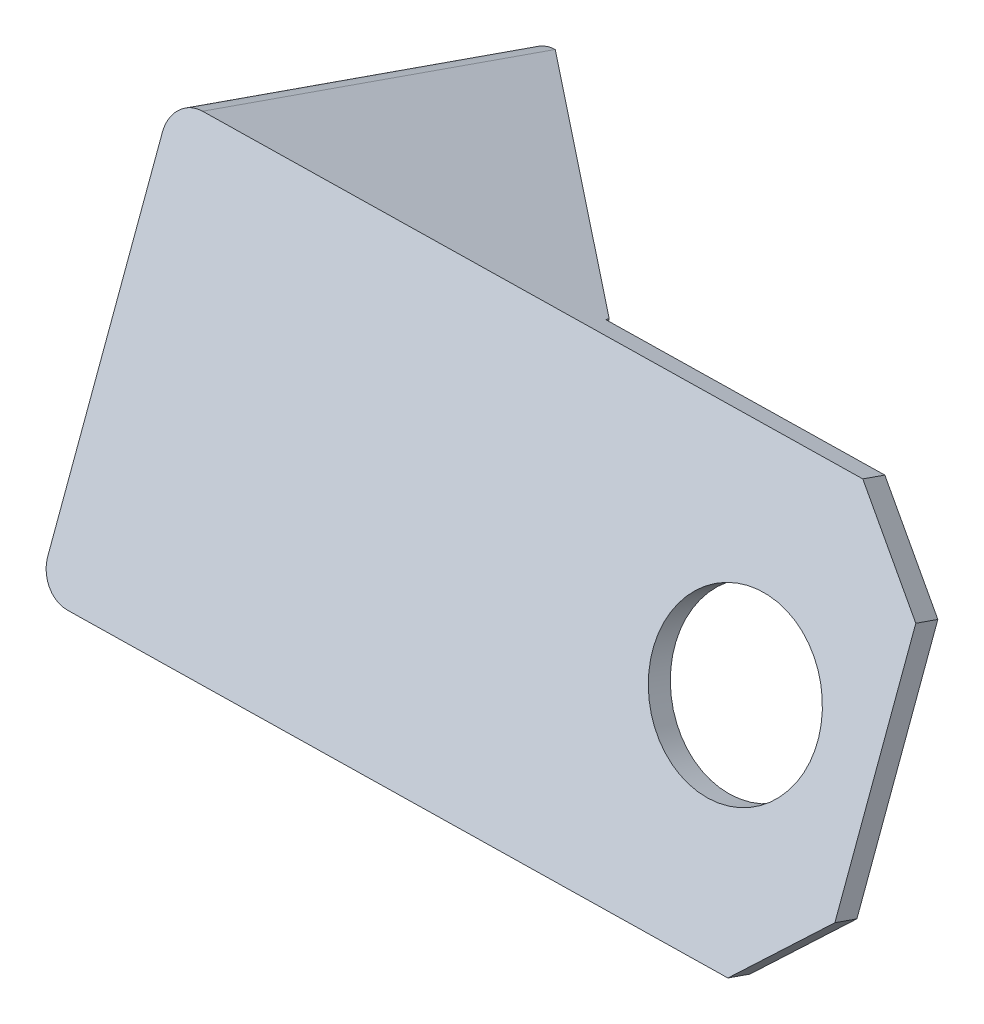
ISO-10303-21;
HEADER;
FILE_DESCRIPTION(('STEP AP214'),'2;1');
FILE_NAME('part.step','',(''),(''),'','','');
FILE_SCHEMA(('AUTOMOTIVE_DESIGN { 1 0 10303 214 1 1 1 1 }'));
ENDSEC;
DATA;
#1=APPLICATION_CONTEXT('core data for automotive mechanical design processes');
#2=APPLICATION_PROTOCOL_DEFINITION('international standard','automotive_design',2000,#1);
#3=PRODUCT_CONTEXT('',#1,'mechanical');
#4=PRODUCT('Part','Part','',(#3));
#5=PRODUCT_RELATED_PRODUCT_CATEGORY('part','',(#4));
#6=PRODUCT_DEFINITION_FORMATION('','',#4);
#7=PRODUCT_DEFINITION_CONTEXT('part definition',#1,'design');
#8=PRODUCT_DEFINITION('design','',#6,#7);
#9=PRODUCT_DEFINITION_SHAPE('','',#8);
#10=(LENGTH_UNIT() NAMED_UNIT(*) SI_UNIT(.MILLI.,.METRE.));
#11=(NAMED_UNIT(*) PLANE_ANGLE_UNIT() SI_UNIT($,.RADIAN.));
#12=(NAMED_UNIT(*) SI_UNIT($,.STERADIAN.) SOLID_ANGLE_UNIT());
#13=UNCERTAINTY_MEASURE_WITH_UNIT(LENGTH_MEASURE(1.E-05),#10,'distance_accuracy_value','');
#14=(GEOMETRIC_REPRESENTATION_CONTEXT(3) GLOBAL_UNCERTAINTY_ASSIGNED_CONTEXT((#13)) GLOBAL_UNIT_ASSIGNED_CONTEXT((#10,
#11,#12)) REPRESENTATION_CONTEXT('',''));
#15=CARTESIAN_POINT('',(0.,0.,0.));
#16=DIRECTION('',(0.,0.,1.));
#17=DIRECTION('',(1.,0.,0.));
#18=AXIS2_PLACEMENT_3D('',#15,#16,#17);
#19=CARTESIAN_POINT('',(215.494974936019,-7.09264298894702,-15.576413619024));
#20=DIRECTION('',(0.,-0.937926471174644,0.346834160183048));
#21=DIRECTION('',(0.,-0.346834160183048,-0.937926471174644));
#22=AXIS2_PLACEMENT_3D('',#19,#20,#21);
#23=PLANE('',#22);
#24=DIRECTION('',(-0.737684868865265,-0.234163416687779,-0.633236550218276));
#25=VECTOR('',#24,1.);
#26=CARTESIAN_POINT('',(215.494974936019,-7.09264298894702,-15.576413619024));
#27=LINE('',#26,#25);
#28=CARTESIAN_POINT('',(254.710935517627,5.35568516045379,18.0869847239463));
#29=VERTEX_POINT('',#28);
#30=CARTESIAN_POINT('',(215.494974936019,-7.09264298894719,-15.5764136190244));
#31=VERTEX_POINT('',#30);
#32=EDGE_CURVE('E215',#29,#31,#27,.T.);
#33=ORIENTED_EDGE('',*,*,#32,.F.);
#34=DIRECTION('',(0.0307715355767674,0.346669914844992,0.937482310627573));
#35=VECTOR('',#34,1.);
#36=CARTESIAN_POINT('',(253.569895079193,-7.49919465662855,-16.6758311931679));
#37=LINE('',#36,#35);
#38=CARTESIAN_POINT('',(254.723827663322,5.50092715005865,18.4797554553661));
#39=VERTEX_POINT('',#38);
#40=EDGE_CURVE('E190',#29,#39,#37,.T.);
#41=ORIENTED_EDGE('',*,*,#40,.T.);
#42=DIRECTION('',(-0.999526444171562,0.0106726196993108,0.0288614377761425));
#43=VECTOR('',#42,1.);
#44=CARTESIAN_POINT('',(216.648907520148,5.90747881774017,19.57917302951));
#45=LINE('',#44,#43);
#46=CARTESIAN_POINT('',(216.648907520148,5.90747881774016,19.57917302951));
#47=VERTEX_POINT('',#46);
#48=EDGE_CURVE('E180',#39,#47,#45,.T.);
#49=ORIENTED_EDGE('',*,*,#48,.T.);
#50=DIRECTION('',(0.0307715355767674,0.346669914844992,0.937482310627573));
#51=VECTOR('',#50,1.);
#52=CARTESIAN_POINT('',(215.494974936019,-7.09264298894702,-15.576413619024));
#53=LINE('',#52,#51);
#54=EDGE_CURVE('E406',#31,#47,#53,.T.);
#55=ORIENTED_EDGE('',*,*,#54,.F.);
#56=EDGE_LOOP('',(#33,#41,#49,#55));
#57=FACE_BOUND('',#56,.T.);
#58=ADVANCED_FACE('F41',(#57),#23,.T.);
#59=CARTESIAN_POINT('',(215.494974936019,-39.9200694800596,-3.43721801261732));
#60=DIRECTION('',(0.,-0.937926471174644,0.346834160183048));
#61=DIRECTION('',(0.,-0.346834160183048,-0.937926471174644));
#62=AXIS2_PLACEMENT_3D('',#59,#60,#61);
#63=PLANE('',#62);
#64=DIRECTION('',(0.0307715355767674,0.346669914844992,0.937482310627573));
#65=VECTOR('',#64,1.);
#66=CARTESIAN_POINT('',(253.569895079193,-40.3266211477411,-4.53663558676126));
#67=LINE('',#66,#65);
#68=CARTESIAN_POINT('',(254.710935517627,-27.4717413306588,30.2261803303528));
#69=VERTEX_POINT('',#68);
#70=CARTESIAN_POINT('',(254.723827663322,-27.3264993410539,30.6189510617728));
#71=VERTEX_POINT('',#70);
#72=EDGE_CURVE('E195',#69,#71,#67,.T.);
#73=ORIENTED_EDGE('',*,*,#72,.F.);
#74=DIRECTION('',(-0.737684868865265,-0.234163416687779,-0.633236550218276));
#75=VECTOR('',#74,1.);
#76=CARTESIAN_POINT('',(215.494974936019,-39.9200694800596,-3.43721801261732));
#77=LINE('',#76,#75);
#78=CARTESIAN_POINT('',(215.494974936018,-39.9200694800597,-3.43721801261775));
#79=VERTEX_POINT('',#78);
#80=EDGE_CURVE('E211',#69,#79,#77,.T.);
#81=ORIENTED_EDGE('',*,*,#80,.T.);
#82=DIRECTION('',(0.0307715355767674,0.346669914844992,0.937482310627573));
#83=VECTOR('',#82,1.);
#84=CARTESIAN_POINT('',(215.494974936019,-39.9200694800596,-3.43721801261732));
#85=LINE('',#84,#83);
#86=CARTESIAN_POINT('',(216.648907520147,-26.9199476733724,31.7183686359167));
#87=VERTEX_POINT('',#86);
#88=EDGE_CURVE('E304',#79,#87,#85,.T.);
#89=ORIENTED_EDGE('',*,*,#88,.T.);
#90=DIRECTION('',(-0.999526444171562,0.010672619699311,0.0288614377761424));
#91=VECTOR('',#90,1.);
#92=CARTESIAN_POINT('',(216.648907520148,-26.9199476733724,31.7183686359167));
#93=LINE('',#92,#91);
#94=EDGE_CURVE('E45',#71,#87,#93,.T.);
#95=ORIENTED_EDGE('',*,*,#94,.F.);
#96=EDGE_LOOP('',(#73,#81,#89,#95));
#97=FACE_BOUND('',#96,.T.);
#98=ADVANCED_FACE('F382',(#97),#63,.F.);
#99=CARTESIAN_POINT('',(215.494974936019,-42.2648856579962,-2.5701326121597));
#100=DIRECTION('',(0.,-0.937926471174644,0.346834160183048));
#101=DIRECTION('',(0.,-0.346834160183048,-0.937926471174644));
#102=AXIS2_PLACEMENT_3D('',#99,#100,#101);
#103=PLANE('',#102);
#104=DIRECTION('',(-0.737684868865265,-0.234163416687779,-0.633236550218276));
#105=VECTOR('',#104,1.);
#106=CARTESIAN_POINT('',(215.494974936019,-42.2648856579962,-2.5701326121597));
#107=LINE('',#106,#105);
#108=CARTESIAN_POINT('',(254.710935517627,-29.8165575085954,31.0932657308105));
#109=VERTEX_POINT('',#108);
#110=CARTESIAN_POINT('',(215.494974936019,-42.2648856579963,-2.57013261215999));
#111=VERTEX_POINT('',#110);
#112=EDGE_CURVE('E208',#109,#111,#107,.T.);
#113=ORIENTED_EDGE('',*,*,#112,.F.);
#114=DIRECTION('',(0.0307715355767674,0.346669914844992,0.937482310627573));
#115=VECTOR('',#114,1.);
#116=CARTESIAN_POINT('',(253.0313932066,-48.738160835465,-20.0754906222861));
#117=LINE('',#116,#115);
#118=CARTESIAN_POINT('',(254.723827663322,-29.6713155189905,31.4860364622304));
#119=VERTEX_POINT('',#118);
#120=EDGE_CURVE('E191',#109,#119,#117,.T.);
#121=ORIENTED_EDGE('',*,*,#120,.T.);
#122=DIRECTION('',(-0.999526444171562,0.0106726196993094,0.0288614377761415));
#123=VECTOR('',#122,1.);
#124=CARTESIAN_POINT('',(268.326224591561,-29.8165575085954,31.0932657308105));
#125=LINE('',#124,#123);
#126=CARTESIAN_POINT('',(282.644421009402,-29.9694425733565,30.6798262091352));
#127=VERTEX_POINT('',#126);
#128=EDGE_CURVE('E172',#127,#119,#125,.T.);
#129=ORIENTED_EDGE('',*,*,#128,.F.);
#130=DIRECTION('',(0.0307715355767674,0.346669914844992,0.937482310627573));
#131=VECTOR('',#130,1.);
#132=CARTESIAN_POINT('',(282.644421009402,-29.9694425733565,30.6798262091352));
#133=LINE('',#132,#131);
#134=CARTESIAN_POINT('',(282.721349848344,-29.1027677862441,33.0235319857041));
#135=VERTEX_POINT('',#134);
#136=EDGE_CURVE('E239',#127,#135,#133,.T.);
#137=ORIENTED_EDGE('',*,*,#136,.T.);
#138=DIRECTION('',(0.999526444171562,-0.0106726196993108,-0.0288614377761425));
#139=VECTOR('',#138,1.);
#140=CARTESIAN_POINT('',(216.725836359089,-28.3980890641965,34.9291598129432));
#141=LINE('',#140,#139);
#142=CARTESIAN_POINT('',(216.725836359089,-28.3980890641965,34.9291598129432));
#143=VERTEX_POINT('',#142);
#144=EDGE_CURVE('E52',#143,#135,#141,.T.);
#145=ORIENTED_EDGE('',*,*,#144,.F.);
#146=DIRECTION('',(0.0307715355767674,0.346669914844992,0.937482310627573));
#147=VECTOR('',#146,1.);
#148=CARTESIAN_POINT('',(215.494974936019,-42.2648856579962,-2.5701326121597));
#149=LINE('',#148,#147);
#150=EDGE_CURVE('E293',#111,#143,#149,.T.);
#151=ORIENTED_EDGE('',*,*,#150,.F.);
#152=EDGE_LOOP('',(#113,#121,#129,#137,#145,#151));
#153=FACE_BOUND('',#152,.T.);
#154=ADVANCED_FACE('F367',(#153),#103,.T.);
#155=CARTESIAN_POINT('',(215.494974936019,-4.74782681101041,-16.4434990194816));
#156=DIRECTION('',(0.,-0.937926471174644,0.346834160183048));
#157=DIRECTION('',(0.,-0.346834160183048,-0.937926471174644));
#158=AXIS2_PLACEMENT_3D('',#155,#156,#157);
#159=PLANE('',#158);
#160=DIRECTION('',(0.0307715355767674,0.346669914844992,0.937482310627573));
#161=VECTOR('',#160,1.);
#162=CARTESIAN_POINT('',(253.0313932066,-11.2211019884793,-33.9488570296081));
#163=LINE('',#162,#161);
#164=CARTESIAN_POINT('',(254.710935517627,7.70050133839038,17.2198993234886));
#165=VERTEX_POINT('',#164);
#166=CARTESIAN_POINT('',(254.723827663322,7.84574332799527,17.6126700549085));
#167=VERTEX_POINT('',#166);
#168=EDGE_CURVE('E165',#165,#167,#163,.T.);
#169=ORIENTED_EDGE('',*,*,#168,.F.);
#170=DIRECTION('',(0.737684868865265,0.234163416687779,0.633236550218276));
#171=VECTOR('',#170,1.);
#172=CARTESIAN_POINT('',(215.494974936019,-4.74782681101057,-16.443499019482));
#173=LINE('',#172,#171);
#174=CARTESIAN_POINT('',(215.494974936019,-4.74782681101057,-16.443499019482));
#175=VERTEX_POINT('',#174);
#176=EDGE_CURVE('E202',#175,#165,#173,.T.);
#177=ORIENTED_EDGE('',*,*,#176,.F.);
#178=DIRECTION('',(0.0307715355767674,0.346669914844992,0.937482310627573));
#179=VECTOR('',#178,1.);
#180=CARTESIAN_POINT('',(215.494974936019,-4.74782681101042,-16.4434990194816));
#181=LINE('',#180,#179);
#182=CARTESIAN_POINT('',(216.725836359089,9.11896978278926,21.0557934056213));
#183=VERTEX_POINT('',#182);
#184=EDGE_CURVE('E303',#175,#183,#181,.T.);
#185=ORIENTED_EDGE('',*,*,#184,.T.);
#186=DIRECTION('',(0.999526444171562,-0.0106726196993109,-0.0288614377761424));
#187=VECTOR('',#186,1.);
#188=CARTESIAN_POINT('',(216.725836359089,9.11896978278926,21.0557934056213));
#189=LINE('',#188,#187);
#190=CARTESIAN_POINT('',(282.721349848344,8.4142910607417,19.1501655783822));
#191=VERTEX_POINT('',#190);
#192=EDGE_CURVE('E11',#183,#191,#189,.T.);
#193=ORIENTED_EDGE('',*,*,#192,.T.);
#194=DIRECTION('',(0.0307715355767674,0.346669914844992,0.937482310627573));
#195=VECTOR('',#194,1.);
#196=CARTESIAN_POINT('',(282.644421009402,7.54761627362923,16.8064598018133));
#197=LINE('',#196,#195);
#198=CARTESIAN_POINT('',(282.644421009402,7.54761627362923,16.8064598018133));
#199=VERTEX_POINT('',#198);
#200=EDGE_CURVE('E168',#199,#191,#197,.T.);
#201=ORIENTED_EDGE('',*,*,#200,.F.);
#202=DIRECTION('',(0.999526444171562,-0.0106726196993106,-0.0288614377761398));
#203=VECTOR('',#202,1.);
#204=CARTESIAN_POINT('',(270.650103679344,7.67568771002096,17.152797055127));
#205=LINE('',#204,#203);
#206=EDGE_CURVE('E160',#167,#199,#205,.T.);
#207=ORIENTED_EDGE('',*,*,#206,.F.);
#208=EDGE_LOOP('',(#169,#177,#185,#193,#201,#207));
#209=FACE_BOUND('',#208,.T.);
#210=ADVANCED_FACE('F162',(#209),#159,.F.);
#211=CARTESIAN_POINT('',(214.995211713933,-7.55626991468471,-15.3885658200444));
#212=DIRECTION('',(-0.999526444171562,0.0106726196993109,0.0288614377761424));
#213=DIRECTION('',(0.0288630816448882,0.,0.999583374470564));
#214=AXIS2_PLACEMENT_3D('',#211,#212,#213);
#215=PLANE('',#214);
#216=CARTESIAN_POINT('',(215.610262419202,-16.4568202057423,9.20312771576499));
#217=DIRECTION('',(-0.999526444171562,0.0106726196993109,0.0288614377761424));
#218=DIRECTION('',(0.0288630816448883,0.,0.999583374470564));
#219=AXIS2_PLACEMENT_3D('',#216,#217,#218);
#220=CIRCLE('',#219,6.25);
#221=CARTESIAN_POINT('',(215.790656679482,-16.4568202057423,15.450523806206));
#222=VERTEX_POINT('',#221);
#223=EDGE_CURVE('E173',#222,#222,#220,.T.);
#224=ORIENTED_EDGE('',*,*,#223,.T.);
#225=EDGE_LOOP('',(#224));
#226=FACE_BOUND('',#225,.T.);
#227=DIRECTION('',(0.,0.937926471174644,-0.346834160183048));
#228=VECTOR('',#227,1.);
#229=CARTESIAN_POINT('',(216.149144298062,5.44385189200249,19.7670208284896));
#230=LINE('',#229,#228);
#231=CARTESIAN_POINT('',(216.149144298062,-26.4456481279354,31.5593822747132));
#232=VERTEX_POINT('',#231);
#233=CARTESIAN_POINT('',(216.149144298062,5.44385189200248,19.7670208284896));
#234=VERTEX_POINT('',#233);
#235=EDGE_CURVE('E60',#232,#234,#230,.T.);
#236=ORIENTED_EDGE('',*,*,#235,.F.);
#237=DIRECTION('',(0.0307715355767674,0.346669914844992,0.937482310627573));
#238=VECTOR('',#237,1.);
#239=CARTESIAN_POINT('',(214.995211713933,-39.4457699346226,-3.59620437382077));
#240=LINE('',#239,#238);
#241=CARTESIAN_POINT('',(214.995211713933,-39.4457699346226,-3.59620437382077));
#242=VERTEX_POINT('',#241);
#243=EDGE_CURVE('E400',#242,#232,#240,.T.);
#244=ORIENTED_EDGE('',*,*,#243,.F.);
#245=DIRECTION('',(0.,-0.937926471174644,0.346834160183048));
#246=VECTOR('',#245,1.);
#247=CARTESIAN_POINT('',(214.995211713933,-7.55626991468471,-15.3885658200444));
#248=LINE('',#247,#246);
#249=CARTESIAN_POINT('',(214.995211713933,-7.55626991468471,-15.3885658200444));
#250=VERTEX_POINT('',#249);
#251=EDGE_CURVE('E334',#250,#242,#248,.T.);
#252=ORIENTED_EDGE('',*,*,#251,.F.);
#253=DIRECTION('',(0.0307715355767674,0.346669914844992,0.937482310627573));
#254=VECTOR('',#253,1.);
#255=CARTESIAN_POINT('',(214.995211713933,-7.55626991468471,-15.3885658200444));
#256=LINE('',#255,#254);
#257=EDGE_CURVE('E403',#250,#234,#256,.T.);
#258=ORIENTED_EDGE('',*,*,#257,.T.);
#259=EDGE_LOOP('',(#236,#244,#252,#258));
#260=FACE_BOUND('',#259,.T.);
#261=ADVANCED_FACE('F426',(#226,#260),#215,.F.);
#262=CARTESIAN_POINT('',(215.494974936019,-39.4511062444722,-3.61063509270884));
#263=DIRECTION('',(0.0307715355767674,0.346669914844992,0.937482310627573));
#264=DIRECTION('',(0.,-0.937926471174644,0.346834160183048));
#265=AXIS2_PLACEMENT_3D('',#262,#263,#264);
#266=CYLINDRICAL_SURFACE('',#265,0.500000000000001);
#267=CARTESIAN_POINT('',(216.648907520147,-26.450984437785,31.5449515558252));
#268=DIRECTION('',(0.0307715355767674,0.346669914844992,0.937482310627573));
#269=DIRECTION('',(0.,-0.937926471174644,0.346834160183048));
#270=AXIS2_PLACEMENT_3D('',#267,#268,#269);
#271=CIRCLE('',#270,0.500000000000001);
#272=EDGE_CURVE('E279',#87,#232,#271,.F.);
#273=ORIENTED_EDGE('',*,*,#272,.F.);
#274=ORIENTED_EDGE('',*,*,#88,.F.);
#275=CARTESIAN_POINT('',(215.494974936019,-39.4511062444722,-3.61063509270884));
#276=DIRECTION('',(0.0307715355767674,0.346669914844992,0.937482310627573));
#277=DIRECTION('',(0.,-0.937926471174644,0.346834160183048));
#278=AXIS2_PLACEMENT_3D('',#275,#276,#277);
#279=CIRCLE('',#278,0.500000000000001);
#280=EDGE_CURVE('E327',#242,#79,#279,.T.);
#281=ORIENTED_EDGE('',*,*,#280,.F.);
#282=ORIENTED_EDGE('',*,*,#243,.T.);
#283=EDGE_LOOP('',(#273,#274,#281,#282));
#284=FACE_BOUND('',#283,.T.);
#285=ADVANCED_FACE('F43',(#284),#266,.F.);
#286=CARTESIAN_POINT('',(215.494974936019,-7.56160622453435,-15.4029965389325));
#287=DIRECTION('',(0.0307715355767674,0.346669914844992,0.937482310627573));
#288=DIRECTION('',(0.,-0.937926471174644,0.346834160183048));
#289=AXIS2_PLACEMENT_3D('',#286,#287,#288);
#290=CYLINDRICAL_SURFACE('',#289,0.499999999999999);
#291=CARTESIAN_POINT('',(216.648907520147,5.43851558215285,19.7525901096015));
#292=DIRECTION('',(0.0307715355767674,0.346669914844992,0.937482310627573));
#293=DIRECTION('',(0.,-0.937926471174644,0.346834160183048));
#294=AXIS2_PLACEMENT_3D('',#291,#292,#293);
#295=CIRCLE('',#294,0.499999999999999);
#296=EDGE_CURVE('E274',#234,#47,#295,.F.);
#297=ORIENTED_EDGE('',*,*,#296,.F.);
#298=ORIENTED_EDGE('',*,*,#257,.F.);
#299=CARTESIAN_POINT('',(215.494974936019,-7.56160622453435,-15.4029965389325));
#300=DIRECTION('',(0.0307715355767674,0.346669914844992,0.937482310627573));
#301=DIRECTION('',(0.,-0.937926471174644,0.346834160183048));
#302=AXIS2_PLACEMENT_3D('',#299,#300,#301);
#303=CIRCLE('',#302,0.499999999999999);
#304=EDGE_CURVE('E313',#31,#250,#303,.T.);
#305=ORIENTED_EDGE('',*,*,#304,.F.);
#306=ORIENTED_EDGE('',*,*,#54,.T.);
#307=EDGE_LOOP('',(#297,#298,#305,#306));
#308=FACE_BOUND('',#307,.T.);
#309=ADVANCED_FACE('F425',(#308),#290,.F.);
#310=CARTESIAN_POINT('',(215.494974936019,-7.56160622453435,-15.4029965389325));
#311=DIRECTION('',(0.0307715355767674,0.346669914844992,0.937482310627573));
#312=DIRECTION('',(0.,-0.937926471174644,0.346834160183048));
#313=AXIS2_PLACEMENT_3D('',#310,#311,#312);
#314=CYLINDRICAL_SURFACE('',#313,3.);
#315=CARTESIAN_POINT('',(216.725836359089,6.30519036926533,22.0962958861705));
#316=DIRECTION('',(0.0307715355767674,0.346669914844992,0.937482310627573));
#317=DIRECTION('',(0.,-0.937926471174644,0.346834160183048));
#318=AXIS2_PLACEMENT_3D('',#315,#316,#317);
#319=CIRCLE('',#318,3.);
#320=CARTESIAN_POINT('',(213.727257026575,6.33720822836324,22.1828801994989));
#321=VERTEX_POINT('',#320);
#322=EDGE_CURVE('E307',#183,#321,#319,.T.);
#323=ORIENTED_EDGE('',*,*,#322,.F.);
#324=ORIENTED_EDGE('',*,*,#184,.F.);
#325=CARTESIAN_POINT('',(215.494974936019,-7.56160622453435,-15.4029965389325));
#326=DIRECTION('',(0.0307715355767674,0.346669914844992,0.937482310627573));
#327=DIRECTION('',(0.,-0.937926471174644,0.346834160183048));
#328=AXIS2_PLACEMENT_3D('',#325,#326,#327);
#329=CIRCLE('',#328,3.);
#330=CARTESIAN_POINT('',(212.496395603504,-7.52958836543643,-15.316412225604));
#331=VERTEX_POINT('',#330);
#332=EDGE_CURVE('E287',#175,#331,#329,.T.);
#333=ORIENTED_EDGE('',*,*,#332,.T.);
#334=DIRECTION('',(0.0307715355767674,0.346669914844992,0.937482310627573));
#335=VECTOR('',#334,1.);
#336=CARTESIAN_POINT('',(212.496395603504,-7.52958836543643,-15.316412225604));
#337=LINE('',#336,#335);
#338=EDGE_CURVE('E321',#331,#321,#337,.T.);
#339=ORIENTED_EDGE('',*,*,#338,.T.);
#340=EDGE_LOOP('',(#323,#324,#333,#339));
#341=FACE_BOUND('',#340,.T.);
#342=ADVANCED_FACE('F342',(#341),#314,.T.);
#343=CARTESIAN_POINT('',(215.494974936019,-39.4511062444722,-3.61063509270884));
#344=DIRECTION('',(0.0307715355767674,0.346669914844992,0.937482310627573));
#345=DIRECTION('',(0.,-0.937926471174644,0.346834160183048));
#346=AXIS2_PLACEMENT_3D('',#343,#344,#345);
#347=CYLINDRICAL_SURFACE('',#346,3.);
#348=CARTESIAN_POINT('',(216.725836359089,-25.5843096506726,33.8886573323941));
#349=DIRECTION('',(0.0307715355767674,0.346669914844992,0.937482310627573));
#350=DIRECTION('',(0.,-0.937926471174644,0.346834160183048));
#351=AXIS2_PLACEMENT_3D('',#348,#349,#350);
#352=CIRCLE('',#351,3.);
#353=CARTESIAN_POINT('',(213.727257026575,-25.5522917915746,33.9752416457225));
#354=VERTEX_POINT('',#353);
#355=EDGE_CURVE('E305',#354,#143,#352,.T.);
#356=ORIENTED_EDGE('',*,*,#355,.F.);
#357=DIRECTION('',(0.0307715355767674,0.346669914844992,0.937482310627573));
#358=VECTOR('',#357,1.);
#359=CARTESIAN_POINT('',(212.496395603504,-39.4190883853743,-3.52405077938043));
#360=LINE('',#359,#358);
#361=CARTESIAN_POINT('',(212.496395603504,-39.4190883853743,-3.52405077938043));
#362=VERTEX_POINT('',#361);
#363=EDGE_CURVE('E299',#362,#354,#360,.T.);
#364=ORIENTED_EDGE('',*,*,#363,.F.);
#365=CARTESIAN_POINT('',(215.494974936019,-39.4511062444722,-3.61063509270884));
#366=DIRECTION('',(0.0307715355767674,0.346669914844992,0.937482310627573));
#367=DIRECTION('',(0.,-0.937926471174644,0.346834160183048));
#368=AXIS2_PLACEMENT_3D('',#365,#366,#367);
#369=CIRCLE('',#368,3.);
#370=EDGE_CURVE('E282',#362,#111,#369,.T.);
#371=ORIENTED_EDGE('',*,*,#370,.T.);
#372=ORIENTED_EDGE('',*,*,#150,.T.);
#373=EDGE_LOOP('',(#356,#364,#371,#372));
#374=FACE_BOUND('',#373,.T.);
#375=ADVANCED_FACE('F416',(#374),#347,.T.);
#376=CARTESIAN_POINT('',(216.725836359089,6.30519036926533,22.0962958861705));
#377=DIRECTION('',(0.0307715355767674,0.346669914844992,0.937482310627573));
#378=DIRECTION('',(0.,-0.937926471174644,0.346834160183048));
#379=AXIS2_PLACEMENT_3D('',#376,#377,#378);
#380=PLANE('',#379);
#381=CARTESIAN_POINT('',(276.724191183315,-10.2802026445553,26.2600174087));
#382=DIRECTION('',(0.0307715355767674,0.346669914844992,0.937482310627573));
#383=DIRECTION('',(0.,-0.937926471174644,0.346834160183048));
#384=AXIS2_PLACEMENT_3D('',#381,#382,#383);
#385=CIRCLE('',#384,8.24999999999998);
#386=CARTESIAN_POINT('',(276.724191183315,-18.0180960317461,29.1213992302102));
#387=VERTEX_POINT('',#386);
#388=EDGE_CURVE('E218',#387,#387,#385,.T.);
#389=ORIENTED_EDGE('',*,*,#388,.F.);
#390=EDGE_LOOP('',(#389));
#391=FACE_BOUND('',#390,.T.);
#392=ORIENTED_EDGE('',*,*,#144,.T.);
#393=DIRECTION('',(0.706771926648989,0.655667486259552,-0.265656904978878));
#394=VECTOR('',#393,1.);
#395=CARTESIAN_POINT('',(290.717561401717,-21.6847369744414,30.0179672020306));
#396=LINE('',#395,#394);
#397=CARTESIAN_POINT('',(290.717561401717,-21.6847369744414,30.0179672020306));
#398=VERTEX_POINT('',#397);
#399=EDGE_CURVE('E223',#135,#398,#396,.T.);
#400=ORIENTED_EDGE('',*,*,#399,.T.);
#401=DIRECTION('',(0.,0.937926471174644,-0.346834160183048));
#402=VECTOR('',#401,1.);
#403=CARTESIAN_POINT('',(290.717561401717,0.825498333750067,21.6939473576374));
#404=LINE('',#403,#402);
#405=CARTESIAN_POINT('',(290.717561401717,0.825498333750067,21.6939473576374));
#406=VERTEX_POINT('',#405);
#407=EDGE_CURVE('E243',#398,#406,#404,.T.);
#408=ORIENTED_EDGE('',*,*,#407,.T.);
#409=DIRECTION('',(-0.706771926648989,0.670760849784368,-0.224840668246271));
#410=VECTOR('',#409,1.);
#411=CARTESIAN_POINT('',(282.721349848344,8.4142910607417,19.1501655783822));
#412=LINE('',#411,#410);
#413=EDGE_CURVE('E232',#406,#191,#412,.T.);
#414=ORIENTED_EDGE('',*,*,#413,.T.);
#415=ORIENTED_EDGE('',*,*,#192,.F.);
#416=ORIENTED_EDGE('',*,*,#322,.T.);
#417=DIRECTION('',(0.,-0.937926471174644,0.346834160183048));
#418=VECTOR('',#417,1.);
#419=CARTESIAN_POINT('',(213.727257026575,6.33720822836324,22.1828801994989));
#420=LINE('',#419,#418);
#421=EDGE_CURVE('E312',#321,#354,#420,.T.);
#422=ORIENTED_EDGE('',*,*,#421,.T.);
#423=ORIENTED_EDGE('',*,*,#355,.T.);
#424=EDGE_LOOP('',(#392,#400,#408,#414,#415,#416,#422,#423));
#425=FACE_BOUND('',#424,.T.);
#426=ADVANCED_FACE('F346',(#391,#425),#380,.T.);
#427=CARTESIAN_POINT('',(215.494974936019,-7.56160622453435,-15.4029965389325));
#428=DIRECTION('',(0.0307715355767674,0.346669914844992,0.937482310627573));
#429=DIRECTION('',(0.,-0.937926471174644,0.346834160183048));
#430=AXIS2_PLACEMENT_3D('',#427,#428,#429);
#431=PLANE('',#430);
#432=ORIENTED_EDGE('',*,*,#332,.F.);
#433=DIRECTION('',(0.,0.937926471174644,-0.346834160183047));
#434=VECTOR('',#433,1.);
#435=CARTESIAN_POINT('',(215.494974936019,-44.6097018359329,-1.70304721170253));
#436=LINE('',#435,#434);
#437=EDGE_CURVE('E270',#31,#175,#436,.T.);
#438=ORIENTED_EDGE('',*,*,#437,.F.);
#439=ORIENTED_EDGE('',*,*,#304,.T.);
#440=ORIENTED_EDGE('',*,*,#251,.T.);
#441=ORIENTED_EDGE('',*,*,#280,.T.);
#442=EDGE_CURVE('E273',#111,#79,#436,.T.);
#443=ORIENTED_EDGE('',*,*,#442,.F.);
#444=ORIENTED_EDGE('',*,*,#370,.F.);
#445=DIRECTION('',(0.,-0.937926471174644,0.346834160183048));
#446=VECTOR('',#445,1.);
#447=CARTESIAN_POINT('',(212.496395603504,-7.52958836543643,-15.316412225604));
#448=LINE('',#447,#446);
#449=EDGE_CURVE('E325',#331,#362,#448,.T.);
#450=ORIENTED_EDGE('',*,*,#449,.F.);
#451=EDGE_LOOP('',(#432,#438,#439,#440,#441,#443,#444,#450));
#452=FACE_BOUND('',#451,.T.);
#453=ADVANCED_FACE('F376',(#452),#431,.F.);
#454=CARTESIAN_POINT('',(212.496395603504,-7.52958836543643,-15.316412225604));
#455=DIRECTION('',(-0.999526444171562,0.0106726196993109,0.0288614377761424));
#456=DIRECTION('',(0.0288630816448882,0.,0.999583374470564));
#457=AXIS2_PLACEMENT_3D('',#454,#455,#456);
#458=PLANE('',#457);
#459=ORIENTED_EDGE('',*,*,#421,.F.);
#460=ORIENTED_EDGE('',*,*,#338,.F.);
#461=ORIENTED_EDGE('',*,*,#449,.T.);
#462=ORIENTED_EDGE('',*,*,#363,.T.);
#463=EDGE_LOOP('',(#459,#460,#461,#462));
#464=FACE_BOUND('',#463,.T.);
#465=CARTESIAN_POINT('',(213.111446308773,-16.430138656494,9.27528131020534));
#466=DIRECTION('',(-0.999526444171563,0.0106726196993109,0.0288614377761424));
#467=DIRECTION('',(0.0288630816448883,0.,0.999583374470564));
#468=AXIS2_PLACEMENT_3D('',#465,#466,#467);
#469=CIRCLE('',#468,6.25);
#470=CARTESIAN_POINT('',(213.291840569054,-16.430138656494,15.5226774006464));
#471=VERTEX_POINT('',#470);
#472=EDGE_CURVE('E252',#471,#471,#469,.T.);
#473=ORIENTED_EDGE('',*,*,#472,.F.);
#474=EDGE_LOOP('',(#473));
#475=FACE_BOUND('',#474,.T.);
#476=ADVANCED_FACE('F413',(#464,#475),#458,.T.);
#477=CARTESIAN_POINT('',(216.648907520147,-26.450984437785,31.5449515558252));
#478=DIRECTION('',(0.0307715355767674,0.346669914844992,0.937482310627573));
#479=DIRECTION('',(0.,-0.937926471174644,0.346834160183048));
#480=AXIS2_PLACEMENT_3D('',#477,#478,#479);
#481=PLANE('',#480);
#482=ORIENTED_EDGE('',*,*,#48,.F.);
#483=DIRECTION('',(0.,0.937926471174644,-0.346834160183048));
#484=VECTOR('',#483,1.);
#485=CARTESIAN_POINT('',(254.723827663322,7.84574332799527,17.6126700549085));
#486=LINE('',#485,#484);
#487=EDGE_CURVE('E176',#39,#167,#486,.T.);
#488=ORIENTED_EDGE('',*,*,#487,.T.);
#489=ORIENTED_EDGE('',*,*,#206,.T.);
#490=DIRECTION('',(-0.706771926648989,0.670760849784368,-0.224840668246271));
#491=VECTOR('',#490,1.);
#492=CARTESIAN_POINT('',(282.644421009402,7.54761627362923,16.8064598018133));
#493=LINE('',#492,#491);
#494=CARTESIAN_POINT('',(290.640632562775,-0.0411764533624033,19.3502415810685));
#495=VERTEX_POINT('',#494);
#496=EDGE_CURVE('E236',#495,#199,#493,.T.);
#497=ORIENTED_EDGE('',*,*,#496,.F.);
#498=DIRECTION('',(0.,0.937926471174644,-0.346834160183048));
#499=VECTOR('',#498,1.);
#500=CARTESIAN_POINT('',(290.640632562775,-0.0411764533624033,19.3502415810685));
#501=LINE('',#500,#499);
#502=CARTESIAN_POINT('',(290.640632562775,-22.5514117615539,27.6742614254617));
#503=VERTEX_POINT('',#502);
#504=EDGE_CURVE('E231',#503,#495,#501,.T.);
#505=ORIENTED_EDGE('',*,*,#504,.F.);
#506=DIRECTION('',(0.706771926648989,0.655667486259552,-0.265656904978878));
#507=VECTOR('',#506,1.);
#508=CARTESIAN_POINT('',(290.640632562775,-22.5514117615539,27.6742614254617));
#509=LINE('',#508,#507);
#510=EDGE_CURVE('E227',#127,#503,#509,.T.);
#511=ORIENTED_EDGE('',*,*,#510,.F.);
#512=ORIENTED_EDGE('',*,*,#128,.T.);
#513=EDGE_CURVE('E184',#119,#71,#486,.T.);
#514=ORIENTED_EDGE('',*,*,#513,.T.);
#515=ORIENTED_EDGE('',*,*,#94,.T.);
#516=ORIENTED_EDGE('',*,*,#272,.T.);
#517=ORIENTED_EDGE('',*,*,#235,.T.);
#518=ORIENTED_EDGE('',*,*,#296,.T.);
#519=EDGE_LOOP('',(#482,#488,#489,#497,#505,#511,#512,#514,#515,#516,#517,#518));
#520=FACE_BOUND('',#519,.T.);
#521=CARTESIAN_POINT('',(276.647262344373,-11.1468774316678,23.9163116321311));
#522=DIRECTION('',(0.0307715355767674,0.346669914844992,0.937482310627573));
#523=DIRECTION('',(0.,-0.937926471174644,0.346834160183048));
#524=AXIS2_PLACEMENT_3D('',#521,#522,#523);
#525=CIRCLE('',#524,8.24999999999998);
#526=CARTESIAN_POINT('',(276.647262344373,-18.8847708188586,26.7776934536413));
#527=VERTEX_POINT('',#526);
#528=EDGE_CURVE('E219',#527,#527,#525,.T.);
#529=ORIENTED_EDGE('',*,*,#528,.T.);
#530=EDGE_LOOP('',(#529));
#531=FACE_BOUND('',#530,.T.);
#532=ADVANCED_FACE('F177',(#520,#531),#481,.F.);
#533=CARTESIAN_POINT('',(223.106710750489,-16.5368648534871,8.98666693244392));
#534=DIRECTION('',(-0.999526444171563,0.0106726196993109,0.0288614377761424));
#535=DIRECTION('',(0.0288630816448883,0.,0.999583374470564));
#536=AXIS2_PLACEMENT_3D('',#533,#534,#535);
#537=CYLINDRICAL_SURFACE('',#536,6.25);
#538=ORIENTED_EDGE('',*,*,#472,.T.);
#539=EDGE_LOOP('',(#538));
#540=FACE_BOUND('',#539,.T.);
#541=ORIENTED_EDGE('',*,*,#223,.F.);
#542=EDGE_LOOP('',(#541));
#543=FACE_BOUND('',#542,.T.);
#544=ADVANCED_FACE('F460',(#540,#543),#537,.F.);
#545=CARTESIAN_POINT('',(282.644421009402,7.54761627362923,16.8064598018133));
#546=DIRECTION('',(0.706771926648989,0.655667486259551,-0.265656904978878));
#547=DIRECTION('',(-0.680105275865628,0.733114461554086,0.));
#548=AXIS2_PLACEMENT_3D('',#545,#546,#547);
#549=PLANE('',#548);
#550=ORIENTED_EDGE('',*,*,#413,.F.);
#551=DIRECTION('',(0.0307715355767674,0.346669914844992,0.937482310627573));
#552=VECTOR('',#551,1.);
#553=CARTESIAN_POINT('',(290.640632562775,-0.0411764533624033,19.3502415810685));
#554=LINE('',#553,#552);
#555=EDGE_CURVE('E253',#495,#406,#554,.T.);
#556=ORIENTED_EDGE('',*,*,#555,.F.);
#557=ORIENTED_EDGE('',*,*,#496,.T.);
#558=ORIENTED_EDGE('',*,*,#200,.T.);
#559=EDGE_LOOP('',(#550,#556,#557,#558));
#560=FACE_BOUND('',#559,.T.);
#561=ADVANCED_FACE('F350',(#560),#549,.T.);
#562=CARTESIAN_POINT('',(290.640632562775,-0.0411764533624033,19.3502415810685));
#563=DIRECTION('',(0.999526444171563,-0.0106726196993109,-0.0288614377761424));
#564=DIRECTION('',(-0.0288630816448883,0.,-0.999583374470564));
#565=AXIS2_PLACEMENT_3D('',#562,#563,#564);
#566=PLANE('',#565);
#567=ORIENTED_EDGE('',*,*,#407,.F.);
#568=DIRECTION('',(0.0307715355767674,0.346669914844992,0.937482310627573));
#569=VECTOR('',#568,1.);
#570=CARTESIAN_POINT('',(290.640632562775,-22.5514117615539,27.6742614254617));
#571=LINE('',#570,#569);
#572=EDGE_CURVE('E256',#503,#398,#571,.T.);
#573=ORIENTED_EDGE('',*,*,#572,.F.);
#574=ORIENTED_EDGE('',*,*,#504,.T.);
#575=ORIENTED_EDGE('',*,*,#555,.T.);
#576=EDGE_LOOP('',(#567,#573,#574,#575));
#577=FACE_BOUND('',#576,.T.);
#578=ADVANCED_FACE('F354',(#577),#566,.T.);
#579=CARTESIAN_POINT('',(290.640632562775,-22.5514117615539,27.6742614254617));
#580=DIRECTION('',(0.706771926648989,-0.670760849784367,0.22484066824627));
#581=DIRECTION('',(0.688386615388985,0.725343965131921,0.));
#582=AXIS2_PLACEMENT_3D('',#579,#580,#581);
#583=PLANE('',#582);
#584=ORIENTED_EDGE('',*,*,#399,.F.);
#585=ORIENTED_EDGE('',*,*,#136,.F.);
#586=ORIENTED_EDGE('',*,*,#510,.T.);
#587=ORIENTED_EDGE('',*,*,#572,.T.);
#588=EDGE_LOOP('',(#584,#585,#586,#587));
#589=FACE_BOUND('',#588,.T.);
#590=ADVANCED_FACE('F357',(#589),#583,.T.);
#591=CARTESIAN_POINT('',(276.647262344373,-11.1468774316678,23.9163116321311));
#592=DIRECTION('',(0.0307715355767674,0.346669914844992,0.937482310627573));
#593=DIRECTION('',(0.,-0.937926471174644,0.346834160183048));
#594=AXIS2_PLACEMENT_3D('',#591,#592,#593);
#595=CYLINDRICAL_SURFACE('',#594,8.24999999999998);
#596=ORIENTED_EDGE('',*,*,#528,.F.);
#597=EDGE_LOOP('',(#596));
#598=FACE_BOUND('',#597,.T.);
#599=ORIENTED_EDGE('',*,*,#388,.T.);
#600=EDGE_LOOP('',(#599));
#601=FACE_BOUND('',#600,.T.);
#602=ADVANCED_FACE('F466',(#598,#601),#595,.F.);
#603=CARTESIAN_POINT('',(215.494974936019,-56.333782725616,2.63237979058559));
#604=DIRECTION('',(-0.675145194937532,0.255854311972626,0.691894165893727));
#605=DIRECTION('',(0.715716539247041,0.,0.69839089015267));
#606=AXIS2_PLACEMENT_3D('',#603,#604,#605);
#607=PLANE('',#606);
#608=DIRECTION('',(0.,0.937926471174644,-0.346834160183048));
#609=VECTOR('',#608,1.);
#610=CARTESIAN_POINT('',(254.710935517627,-43.8854545762151,36.2957781335562));
#611=LINE('',#610,#609);
#612=EDGE_CURVE('E207',#109,#69,#611,.T.);
#613=ORIENTED_EDGE('',*,*,#612,.F.);
#614=ORIENTED_EDGE('',*,*,#112,.T.);
#615=ORIENTED_EDGE('',*,*,#442,.T.);
#616=ORIENTED_EDGE('',*,*,#80,.F.);
#617=EDGE_LOOP('',(#613,#614,#615,#616));
#618=FACE_BOUND('',#617,.T.);
#619=ADVANCED_FACE('F372',(#618),#607,.F.);
#620=ORIENTED_EDGE('',*,*,#32,.T.);
#621=ORIENTED_EDGE('',*,*,#437,.T.);
#622=ORIENTED_EDGE('',*,*,#176,.T.);
#623=EDGE_CURVE('E188',#29,#165,#611,.T.);
#624=ORIENTED_EDGE('',*,*,#623,.F.);
#625=EDGE_LOOP('',(#620,#621,#622,#624));
#626=FACE_BOUND('',#625,.T.);
#627=ADVANCED_FACE('F474',(#626),#607,.F.);
#628=CARTESIAN_POINT('',(253.0313932066,-11.2211019884793,-33.9488570296081));
#629=DIRECTION('',(0.999526444171562,-0.0106726196993148,-0.028861437776141));
#630=DIRECTION('',(-0.0288630816448868,0.,-0.999583374470565));
#631=AXIS2_PLACEMENT_3D('',#628,#629,#630);
#632=PLANE('',#631);
#633=ORIENTED_EDGE('',*,*,#623,.T.);
#634=ORIENTED_EDGE('',*,*,#168,.T.);
#635=ORIENTED_EDGE('',*,*,#487,.F.);
#636=ORIENTED_EDGE('',*,*,#40,.F.);
#637=EDGE_LOOP('',(#633,#634,#635,#636));
#638=FACE_BOUND('',#637,.T.);
#639=ADVANCED_FACE('F186',(#638),#632,.T.);
#640=ORIENTED_EDGE('',*,*,#72,.T.);
#641=ORIENTED_EDGE('',*,*,#513,.F.);
#642=ORIENTED_EDGE('',*,*,#120,.F.);
#643=ORIENTED_EDGE('',*,*,#612,.T.);
#644=EDGE_LOOP('',(#640,#641,#642,#643));
#645=FACE_BOUND('',#644,.T.);
#646=ADVANCED_FACE('F362',(#645),#632,.T.);
#647=CLOSED_SHELL('',(#58,#98,#154,#210,#261,#285,#309,#342,#375,#426,#453,#476,#532,#544,#561,
#578,#590,#602,#619,#627,#639,#646));
#648=MANIFOLD_SOLID_BREP('B2',#647);
#649=ADVANCED_BREP_SHAPE_REPRESENTATION('',(#18,#648),#14);
#650=SHAPE_DEFINITION_REPRESENTATION(#9,#649);
ENDSEC;
END-ISO-10303-21;
